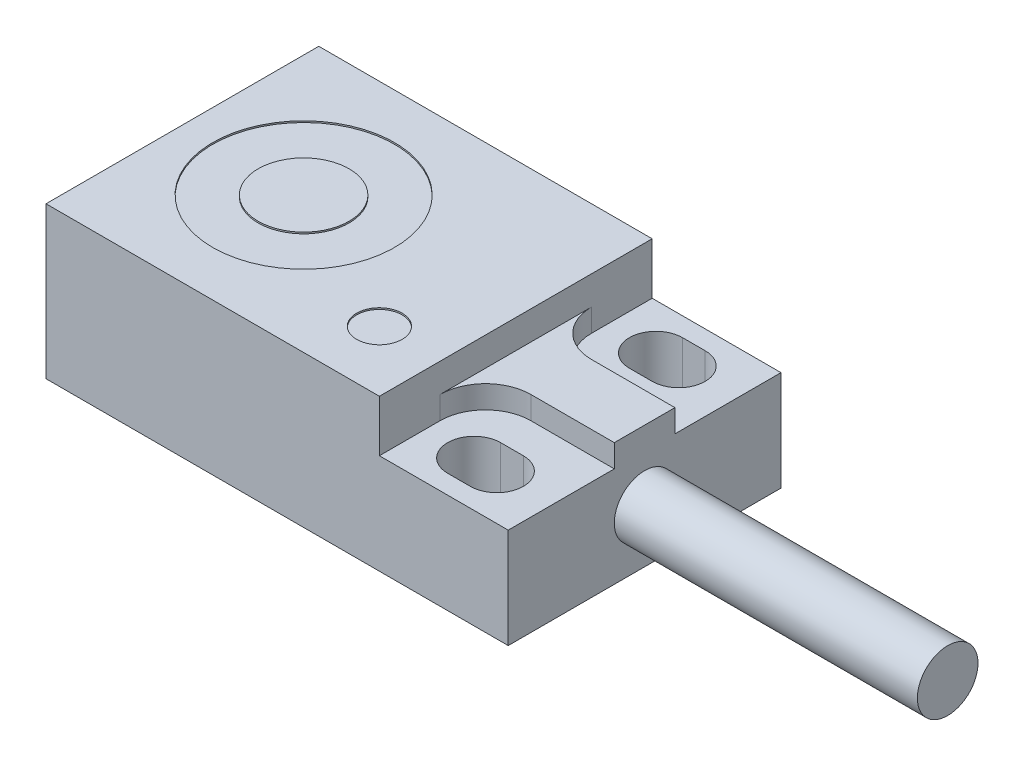
ISO-10303-21;
HEADER;
FILE_DESCRIPTION(('STEP AP214'),'2;1');
FILE_NAME('part.step','',(''),(''),'','','');
FILE_SCHEMA(('AUTOMOTIVE_DESIGN { 1 0 10303 214 1 1 1 1 }'));
ENDSEC;
DATA;
#1=APPLICATION_CONTEXT('core data for automotive mechanical design processes');
#2=APPLICATION_PROTOCOL_DEFINITION('international standard','automotive_design',2000,#1);
#3=PRODUCT_CONTEXT('',#1,'mechanical');
#4=PRODUCT('Part','Part','',(#3));
#5=PRODUCT_RELATED_PRODUCT_CATEGORY('part','',(#4));
#6=PRODUCT_DEFINITION_FORMATION('','',#4);
#7=PRODUCT_DEFINITION_CONTEXT('part definition',#1,'design');
#8=PRODUCT_DEFINITION('design','',#6,#7);
#9=PRODUCT_DEFINITION_SHAPE('','',#8);
#10=(LENGTH_UNIT() NAMED_UNIT(*) SI_UNIT(.MILLI.,.METRE.));
#11=(NAMED_UNIT(*) PLANE_ANGLE_UNIT() SI_UNIT($,.RADIAN.));
#12=(NAMED_UNIT(*) SI_UNIT($,.STERADIAN.) SOLID_ANGLE_UNIT());
#13=UNCERTAINTY_MEASURE_WITH_UNIT(LENGTH_MEASURE(1.E-05),#10,'distance_accuracy_value','');
#14=(GEOMETRIC_REPRESENTATION_CONTEXT(3) GLOBAL_UNCERTAINTY_ASSIGNED_CONTEXT((#13)) GLOBAL_UNIT_ASSIGNED_CONTEXT((#10,
#11,#12)) REPRESENTATION_CONTEXT('',''));
#15=CARTESIAN_POINT('',(0.,0.,0.));
#16=DIRECTION('',(0.,0.,1.));
#17=DIRECTION('',(1.,0.,0.));
#18=AXIS2_PLACEMENT_3D('',#15,#16,#17);
#19=CARTESIAN_POINT('',(-15.25,10.,-9.));
#20=DIRECTION('',(1.,0.,0.));
#21=DIRECTION('',(0.,0.,-1.));
#22=AXIS2_PLACEMENT_3D('',#19,#20,#21);
#23=PLANE('',#22);
#24=DIRECTION('',(0.,0.,1.));
#25=VECTOR('',#24,1.);
#26=CARTESIAN_POINT('',(-15.25,0.,-9.));
#27=LINE('',#26,#25);
#28=CARTESIAN_POINT('',(-15.25,0.,-9.));
#29=VERTEX_POINT('',#28);
#30=CARTESIAN_POINT('',(-15.25,0.,9.));
#31=VERTEX_POINT('',#30);
#32=EDGE_CURVE('E215',#29,#31,#27,.T.);
#33=ORIENTED_EDGE('',*,*,#32,.T.);
#34=DIRECTION('',(0.,-1.,0.));
#35=VECTOR('',#34,1.);
#36=CARTESIAN_POINT('',(-15.25,10.,9.));
#37=LINE('',#36,#35);
#38=CARTESIAN_POINT('',(-15.25,10.,9.));
#39=VERTEX_POINT('',#38);
#40=EDGE_CURVE('E232',#39,#31,#37,.T.);
#41=ORIENTED_EDGE('',*,*,#40,.F.);
#42=DIRECTION('',(0.,0.,1.));
#43=VECTOR('',#42,1.);
#44=CARTESIAN_POINT('',(-15.25,10.,-9.));
#45=LINE('',#44,#43);
#46=CARTESIAN_POINT('',(-15.25,10.,-9.));
#47=VERTEX_POINT('',#46);
#48=EDGE_CURVE('E205',#47,#39,#45,.T.);
#49=ORIENTED_EDGE('',*,*,#48,.F.);
#50=DIRECTION('',(0.,-1.,0.));
#51=VECTOR('',#50,1.);
#52=CARTESIAN_POINT('',(-15.25,10.,-9.));
#53=LINE('',#52,#51);
#54=EDGE_CURVE('E214',#47,#29,#53,.T.);
#55=ORIENTED_EDGE('',*,*,#54,.T.);
#56=EDGE_LOOP('',(#33,#41,#49,#55));
#57=FACE_BOUND('',#56,.T.);
#58=ADVANCED_FACE('F34',(#57),#23,.F.);
#59=CARTESIAN_POINT('',(-15.25,10.,9.));
#60=DIRECTION('',(0.,0.,-1.));
#61=DIRECTION('',(-1.,0.,0.));
#62=AXIS2_PLACEMENT_3D('',#59,#60,#61);
#63=PLANE('',#62);
#64=DIRECTION('',(1.,0.,0.));
#65=VECTOR('',#64,1.);
#66=CARTESIAN_POINT('',(6.75,6.6,9.));
#67=LINE('',#66,#65);
#68=CARTESIAN_POINT('',(6.75,6.6,9.));
#69=VERTEX_POINT('',#68);
#70=CARTESIAN_POINT('',(15.25,6.6,9.));
#71=VERTEX_POINT('',#70);
#72=EDGE_CURVE('E198',#69,#71,#67,.T.);
#73=ORIENTED_EDGE('',*,*,#72,.F.);
#74=DIRECTION('',(0.,1.,0.));
#75=VECTOR('',#74,1.);
#76=CARTESIAN_POINT('',(6.75,6.6,9.));
#77=LINE('',#76,#75);
#78=CARTESIAN_POINT('',(6.75,10.,9.));
#79=VERTEX_POINT('',#78);
#80=EDGE_CURVE('E219',#69,#79,#77,.T.);
#81=ORIENTED_EDGE('',*,*,#80,.T.);
#82=DIRECTION('',(1.,0.,0.));
#83=VECTOR('',#82,1.);
#84=CARTESIAN_POINT('',(-15.25,10.,9.));
#85=LINE('',#84,#83);
#86=EDGE_CURVE('E208',#39,#79,#85,.T.);
#87=ORIENTED_EDGE('',*,*,#86,.F.);
#88=ORIENTED_EDGE('',*,*,#40,.T.);
#89=DIRECTION('',(1.,0.,0.));
#90=VECTOR('',#89,1.);
#91=CARTESIAN_POINT('',(-15.25,0.,9.));
#92=LINE('',#91,#90);
#93=CARTESIAN_POINT('',(15.25,0.,9.));
#94=VERTEX_POINT('',#93);
#95=EDGE_CURVE('E218',#31,#94,#92,.T.);
#96=ORIENTED_EDGE('',*,*,#95,.T.);
#97=DIRECTION('',(0.,-1.,0.));
#98=VECTOR('',#97,1.);
#99=CARTESIAN_POINT('',(15.25,10.,9.));
#100=LINE('',#99,#98);
#101=EDGE_CURVE('E230',#71,#94,#100,.T.);
#102=ORIENTED_EDGE('',*,*,#101,.F.);
#103=EDGE_LOOP('',(#73,#81,#87,#88,#96,#102));
#104=FACE_BOUND('',#103,.T.);
#105=ADVANCED_FACE('F375',(#104),#63,.F.);
#106=CARTESIAN_POINT('',(15.25,10.,-9.));
#107=DIRECTION('',(-1.,0.,0.));
#108=DIRECTION('',(0.,0.,1.));
#109=AXIS2_PLACEMENT_3D('',#106,#107,#108);
#110=PLANE('',#109);
#111=CARTESIAN_POINT('',(15.25,3.5,0.));
#112=DIRECTION('',(-1.,0.,0.));
#113=DIRECTION('',(0.,0.,1.));
#114=AXIS2_PLACEMENT_3D('',#111,#112,#113);
#115=CIRCLE('',#114,2.);
#116=CARTESIAN_POINT('',(15.25,3.5,2.));
#117=VERTEX_POINT('',#116);
#118=EDGE_CURVE('E11',#117,#117,#115,.F.);
#119=ORIENTED_EDGE('',*,*,#118,.F.);
#120=EDGE_LOOP('',(#119));
#121=FACE_BOUND('',#120,.T.);
#122=DIRECTION('',(0.,1.,0.));
#123=VECTOR('',#122,1.);
#124=CARTESIAN_POINT('',(15.25,6.6,-2.));
#125=LINE('',#124,#123);
#126=CARTESIAN_POINT('',(15.25,6.6,-2.));
#127=VERTEX_POINT('',#126);
#128=CARTESIAN_POINT('',(15.25,8.1,-2.));
#129=VERTEX_POINT('',#128);
#130=EDGE_CURVE('E186',#127,#129,#125,.T.);
#131=ORIENTED_EDGE('',*,*,#130,.T.);
#132=DIRECTION('',(0.,0.,-1.));
#133=VECTOR('',#132,1.);
#134=CARTESIAN_POINT('',(15.25,8.1,-2.));
#135=LINE('',#134,#133);
#136=CARTESIAN_POINT('',(15.25,8.1,2.));
#137=VERTEX_POINT('',#136);
#138=EDGE_CURVE('E169',#137,#129,#135,.T.);
#139=ORIENTED_EDGE('',*,*,#138,.F.);
#140=DIRECTION('',(0.,1.,0.));
#141=VECTOR('',#140,1.);
#142=CARTESIAN_POINT('',(15.25,6.6,2.));
#143=LINE('',#142,#141);
#144=CARTESIAN_POINT('',(15.25,6.6,2.));
#145=VERTEX_POINT('',#144);
#146=EDGE_CURVE('E266',#145,#137,#143,.T.);
#147=ORIENTED_EDGE('',*,*,#146,.F.);
#148=DIRECTION('',(0.,0.,-1.));
#149=VECTOR('',#148,1.);
#150=CARTESIAN_POINT('',(15.25,6.6,9.));
#151=LINE('',#150,#149);
#152=EDGE_CURVE('E274',#71,#145,#151,.T.);
#153=ORIENTED_EDGE('',*,*,#152,.F.);
#154=ORIENTED_EDGE('',*,*,#101,.T.);
#155=DIRECTION('',(0.,0.,-1.));
#156=VECTOR('',#155,1.);
#157=CARTESIAN_POINT('',(15.25,0.,-9.));
#158=LINE('',#157,#156);
#159=CARTESIAN_POINT('',(15.25,0.,-9.));
#160=VERTEX_POINT('',#159);
#161=EDGE_CURVE('E222',#94,#160,#158,.T.);
#162=ORIENTED_EDGE('',*,*,#161,.T.);
#163=DIRECTION('',(0.,-1.,0.));
#164=VECTOR('',#163,1.);
#165=CARTESIAN_POINT('',(15.25,10.,-9.));
#166=LINE('',#165,#164);
#167=CARTESIAN_POINT('',(15.25,6.6,-9.));
#168=VERTEX_POINT('',#167);
#169=EDGE_CURVE('E228',#168,#160,#166,.T.);
#170=ORIENTED_EDGE('',*,*,#169,.F.);
#171=DIRECTION('',(0.,0.,-1.));
#172=VECTOR('',#171,1.);
#173=CARTESIAN_POINT('',(15.25,6.6,-9.));
#174=LINE('',#173,#172);
#175=EDGE_CURVE('E194',#127,#168,#174,.T.);
#176=ORIENTED_EDGE('',*,*,#175,.F.);
#177=EDGE_LOOP('',(#131,#139,#147,#153,#154,#162,#170,#176));
#178=FACE_BOUND('',#177,.T.);
#179=ADVANCED_FACE('F192',(#121,#178),#110,.F.);
#180=CARTESIAN_POINT('',(-15.25,10.,-9.));
#181=DIRECTION('',(0.,0.,1.));
#182=DIRECTION('',(1.,0.,0.));
#183=AXIS2_PLACEMENT_3D('',#180,#181,#182);
#184=PLANE('',#183);
#185=DIRECTION('',(-1.,0.,0.));
#186=VECTOR('',#185,1.);
#187=CARTESIAN_POINT('',(-15.25,10.,-9.));
#188=LINE('',#187,#186);
#189=CARTESIAN_POINT('',(6.74999999999999,10.,-9.));
#190=VERTEX_POINT('',#189);
#191=EDGE_CURVE('E212',#190,#47,#188,.T.);
#192=ORIENTED_EDGE('',*,*,#191,.F.);
#193=DIRECTION('',(0.,1.,0.));
#194=VECTOR('',#193,1.);
#195=CARTESIAN_POINT('',(6.75,6.6,-9.));
#196=LINE('',#195,#194);
#197=CARTESIAN_POINT('',(6.75,6.6,-9.));
#198=VERTEX_POINT('',#197);
#199=EDGE_CURVE('E196',#198,#190,#196,.T.);
#200=ORIENTED_EDGE('',*,*,#199,.F.);
#201=DIRECTION('',(-1.,0.,0.));
#202=VECTOR('',#201,1.);
#203=CARTESIAN_POINT('',(6.75,6.6,-9.));
#204=LINE('',#203,#202);
#205=EDGE_CURVE('E259',#168,#198,#204,.T.);
#206=ORIENTED_EDGE('',*,*,#205,.F.);
#207=ORIENTED_EDGE('',*,*,#169,.T.);
#208=DIRECTION('',(-1.,0.,0.));
#209=VECTOR('',#208,1.);
#210=CARTESIAN_POINT('',(-15.25,0.,-9.));
#211=LINE('',#210,#209);
#212=EDGE_CURVE('E209',#160,#29,#211,.T.);
#213=ORIENTED_EDGE('',*,*,#212,.T.);
#214=ORIENTED_EDGE('',*,*,#54,.F.);
#215=EDGE_LOOP('',(#192,#200,#206,#207,#213,#214));
#216=FACE_BOUND('',#215,.T.);
#217=ADVANCED_FACE('F374',(#216),#184,.F.);
#218=CARTESIAN_POINT('',(0.,10.,0.));
#219=DIRECTION('',(0.,1.,0.));
#220=DIRECTION('',(0.,0.,1.));
#221=AXIS2_PLACEMENT_3D('',#218,#219,#220);
#222=PLANE('',#221);
#223=CARTESIAN_POINT('',(-7.25,10.,0.));
#224=DIRECTION('',(0.,1.,0.));
#225=DIRECTION('',(0.,0.,1.));
#226=AXIS2_PLACEMENT_3D('',#223,#224,#225);
#227=CIRCLE('',#226,6.);
#228=CARTESIAN_POINT('',(-7.25,10.,6.));
#229=VERTEX_POINT('',#228);
#230=EDGE_CURVE('E351',#229,#229,#227,.T.);
#231=ORIENTED_EDGE('',*,*,#230,.F.);
#232=EDGE_LOOP('',(#231));
#233=FACE_BOUND('',#232,.T.);
#234=CARTESIAN_POINT('',(2.74999999999999,10.,5.));
#235=DIRECTION('',(0.,1.,0.));
#236=DIRECTION('',(0.,0.,1.));
#237=AXIS2_PLACEMENT_3D('',#234,#235,#236);
#238=CIRCLE('',#237,1.5);
#239=CARTESIAN_POINT('',(2.74999999999999,10.,6.5));
#240=VERTEX_POINT('',#239);
#241=EDGE_CURVE('E343',#240,#240,#238,.T.);
#242=ORIENTED_EDGE('',*,*,#241,.F.);
#243=EDGE_LOOP('',(#242));
#244=FACE_BOUND('',#243,.T.);
#245=DIRECTION('',(0.,0.,1.));
#246=VECTOR('',#245,1.);
#247=CARTESIAN_POINT('',(6.75,10.,9.));
#248=LINE('',#247,#246);
#249=EDGE_CURVE('E195',#190,#79,#248,.T.);
#250=ORIENTED_EDGE('',*,*,#249,.F.);
#251=ORIENTED_EDGE('',*,*,#191,.T.);
#252=ORIENTED_EDGE('',*,*,#48,.T.);
#253=ORIENTED_EDGE('',*,*,#86,.T.);
#254=EDGE_LOOP('',(#250,#251,#252,#253));
#255=FACE_BOUND('',#254,.T.);
#256=ADVANCED_FACE('F381',(#233,#244,#255),#222,.T.);
#257=CARTESIAN_POINT('',(0.,0.,0.));
#258=DIRECTION('',(0.,1.,0.));
#259=DIRECTION('',(0.,0.,1.));
#260=AXIS2_PLACEMENT_3D('',#257,#258,#259);
#261=PLANE('',#260);
#262=DIRECTION('',(-1.,0.,0.));
#263=VECTOR('',#262,1.);
#264=CARTESIAN_POINT('',(10.,0.,-7.75));
#265=LINE('',#264,#263);
#266=CARTESIAN_POINT('',(11.5,0.,-7.75));
#267=VERTEX_POINT('',#266);
#268=CARTESIAN_POINT('',(10.,0.,-7.75));
#269=VERTEX_POINT('',#268);
#270=EDGE_CURVE('E315',#267,#269,#265,.T.);
#271=ORIENTED_EDGE('',*,*,#270,.T.);
#272=CARTESIAN_POINT('',(10.,0.,-6.));
#273=DIRECTION('',(0.,1.,0.));
#274=DIRECTION('',(0.,0.,1.));
#275=AXIS2_PLACEMENT_3D('',#272,#273,#274);
#276=CIRCLE('',#275,1.75);
#277=CARTESIAN_POINT('',(10.,0.,-4.25));
#278=VERTEX_POINT('',#277);
#279=EDGE_CURVE('E323',#269,#278,#276,.T.);
#280=ORIENTED_EDGE('',*,*,#279,.T.);
#281=DIRECTION('',(1.,0.,0.));
#282=VECTOR('',#281,1.);
#283=CARTESIAN_POINT('',(10.,0.,-4.25));
#284=LINE('',#283,#282);
#285=CARTESIAN_POINT('',(11.5,0.,-4.25));
#286=VERTEX_POINT('',#285);
#287=EDGE_CURVE('E336',#278,#286,#284,.T.);
#288=ORIENTED_EDGE('',*,*,#287,.T.);
#289=CARTESIAN_POINT('',(11.5,0.,-6.));
#290=DIRECTION('',(0.,1.,0.));
#291=DIRECTION('',(0.,0.,1.));
#292=AXIS2_PLACEMENT_3D('',#289,#290,#291);
#293=CIRCLE('',#292,1.75);
#294=EDGE_CURVE('E333',#286,#267,#293,.T.);
#295=ORIENTED_EDGE('',*,*,#294,.T.);
#296=EDGE_LOOP('',(#271,#280,#288,#295));
#297=FACE_BOUND('',#296,.T.);
#298=DIRECTION('',(-1.,0.,0.));
#299=VECTOR('',#298,1.);
#300=CARTESIAN_POINT('',(10.,0.,4.25));
#301=LINE('',#300,#299);
#302=CARTESIAN_POINT('',(11.5,0.,4.25));
#303=VERTEX_POINT('',#302);
#304=CARTESIAN_POINT('',(10.,0.,4.25));
#305=VERTEX_POINT('',#304);
#306=EDGE_CURVE('E282',#303,#305,#301,.T.);
#307=ORIENTED_EDGE('',*,*,#306,.T.);
#308=CARTESIAN_POINT('',(10.,0.,6.));
#309=DIRECTION('',(0.,1.,0.));
#310=DIRECTION('',(0.,0.,-1.));
#311=AXIS2_PLACEMENT_3D('',#308,#309,#310);
#312=CIRCLE('',#311,1.75);
#313=CARTESIAN_POINT('',(10.,0.,7.75));
#314=VERTEX_POINT('',#313);
#315=EDGE_CURVE('E292',#305,#314,#312,.T.);
#316=ORIENTED_EDGE('',*,*,#315,.T.);
#317=DIRECTION('',(1.,0.,0.));
#318=VECTOR('',#317,1.);
#319=CARTESIAN_POINT('',(10.,0.,7.75));
#320=LINE('',#319,#318);
#321=CARTESIAN_POINT('',(11.5,0.,7.75));
#322=VERTEX_POINT('',#321);
#323=EDGE_CURVE('E306',#314,#322,#320,.T.);
#324=ORIENTED_EDGE('',*,*,#323,.T.);
#325=CARTESIAN_POINT('',(11.5,0.,6.));
#326=DIRECTION('',(0.,1.,0.));
#327=DIRECTION('',(0.,0.,-1.));
#328=AXIS2_PLACEMENT_3D('',#325,#326,#327);
#329=CIRCLE('',#328,1.75);
#330=EDGE_CURVE('E303',#322,#303,#329,.T.);
#331=ORIENTED_EDGE('',*,*,#330,.T.);
#332=EDGE_LOOP('',(#307,#316,#324,#331));
#333=FACE_BOUND('',#332,.T.);
#334=ORIENTED_EDGE('',*,*,#32,.F.);
#335=ORIENTED_EDGE('',*,*,#212,.F.);
#336=ORIENTED_EDGE('',*,*,#161,.F.);
#337=ORIENTED_EDGE('',*,*,#95,.F.);
#338=EDGE_LOOP('',(#334,#335,#336,#337));
#339=FACE_BOUND('',#338,.T.);
#340=ADVANCED_FACE('F450',(#297,#333,#339),#261,.F.);
#341=CARTESIAN_POINT('',(6.75,6.6,-2.));
#342=DIRECTION('',(0.,0.,1.));
#343=DIRECTION('',(1.,0.,0.));
#344=AXIS2_PLACEMENT_3D('',#341,#342,#343);
#345=PLANE('',#344);
#346=DIRECTION('',(1.,0.,0.));
#347=VECTOR('',#346,1.);
#348=CARTESIAN_POINT('',(6.75,6.6,-2.));
#349=LINE('',#348,#347);
#350=CARTESIAN_POINT('',(9.75,6.6,-2.));
#351=VERTEX_POINT('',#350);
#352=EDGE_CURVE('E261',#351,#127,#349,.T.);
#353=ORIENTED_EDGE('',*,*,#352,.F.);
#354=DIRECTION('',(0.,1.,0.));
#355=VECTOR('',#354,1.);
#356=CARTESIAN_POINT('',(9.75,8.1,-2.));
#357=LINE('',#356,#355);
#358=CARTESIAN_POINT('',(9.75,8.1,-2.));
#359=VERTEX_POINT('',#358);
#360=EDGE_CURVE('E189',#351,#359,#357,.T.);
#361=ORIENTED_EDGE('',*,*,#360,.T.);
#362=DIRECTION('',(-1.,0.,0.));
#363=VECTOR('',#362,1.);
#364=CARTESIAN_POINT('',(15.25,8.1,-2.));
#365=LINE('',#364,#363);
#366=EDGE_CURVE('E173',#129,#359,#365,.T.);
#367=ORIENTED_EDGE('',*,*,#366,.F.);
#368=ORIENTED_EDGE('',*,*,#130,.F.);
#369=EDGE_LOOP('',(#353,#361,#367,#368));
#370=FACE_BOUND('',#369,.T.);
#371=ADVANCED_FACE('F185',(#370),#345,.F.);
#372=CARTESIAN_POINT('',(0.,6.6,0.));
#373=DIRECTION('',(0.,-1.,0.));
#374=DIRECTION('',(0.,0.,-1.));
#375=AXIS2_PLACEMENT_3D('',#372,#373,#374);
#376=PLANE('',#375);
#377=DIRECTION('',(1.,0.,0.));
#378=VECTOR('',#377,1.);
#379=CARTESIAN_POINT('',(10.,6.6,-4.25));
#380=LINE('',#379,#378);
#381=CARTESIAN_POINT('',(10.,6.6,-4.25));
#382=VERTEX_POINT('',#381);
#383=CARTESIAN_POINT('',(11.5,6.6,-4.25));
#384=VERTEX_POINT('',#383);
#385=EDGE_CURVE('E327',#382,#384,#380,.T.);
#386=ORIENTED_EDGE('',*,*,#385,.F.);
#387=CARTESIAN_POINT('',(10.,6.6,-6.));
#388=DIRECTION('',(0.,1.,0.));
#389=DIRECTION('',(0.,0.,1.));
#390=AXIS2_PLACEMENT_3D('',#387,#388,#389);
#391=CIRCLE('',#390,1.75);
#392=CARTESIAN_POINT('',(10.,6.6,-7.75));
#393=VERTEX_POINT('',#392);
#394=EDGE_CURVE('E288',#393,#382,#391,.T.);
#395=ORIENTED_EDGE('',*,*,#394,.F.);
#396=DIRECTION('',(-1.,0.,0.));
#397=VECTOR('',#396,1.);
#398=CARTESIAN_POINT('',(10.,6.6,-7.75));
#399=LINE('',#398,#397);
#400=CARTESIAN_POINT('',(11.5,6.6,-7.75));
#401=VERTEX_POINT('',#400);
#402=EDGE_CURVE('E320',#401,#393,#399,.T.);
#403=ORIENTED_EDGE('',*,*,#402,.F.);
#404=CARTESIAN_POINT('',(11.5,6.6,-6.));
#405=DIRECTION('',(0.,1.,0.));
#406=DIRECTION('',(0.,0.,1.));
#407=AXIS2_PLACEMENT_3D('',#404,#405,#406);
#408=CIRCLE('',#407,1.75);
#409=EDGE_CURVE('E324',#384,#401,#408,.T.);
#410=ORIENTED_EDGE('',*,*,#409,.F.);
#411=EDGE_LOOP('',(#386,#395,#403,#410));
#412=FACE_BOUND('',#411,.T.);
#413=DIRECTION('',(0.,0.,1.));
#414=VECTOR('',#413,1.);
#415=CARTESIAN_POINT('',(6.75,6.6,-9.));
#416=LINE('',#415,#414);
#417=CARTESIAN_POINT('',(6.75,6.6,-5.));
#418=VERTEX_POINT('',#417);
#419=EDGE_CURVE('E254',#198,#418,#416,.T.);
#420=ORIENTED_EDGE('',*,*,#419,.T.);
#421=CARTESIAN_POINT('',(9.75,6.6,-5.));
#422=DIRECTION('',(0.,-1.,0.));
#423=DIRECTION('',(0.,0.,-1.));
#424=AXIS2_PLACEMENT_3D('',#421,#422,#423);
#425=CIRCLE('',#424,3.);
#426=EDGE_CURVE('E241',#418,#351,#425,.F.);
#427=ORIENTED_EDGE('',*,*,#426,.T.);
#428=ORIENTED_EDGE('',*,*,#352,.T.);
#429=ORIENTED_EDGE('',*,*,#175,.T.);
#430=ORIENTED_EDGE('',*,*,#205,.T.);
#431=EDGE_LOOP('',(#420,#427,#428,#429,#430));
#432=FACE_BOUND('',#431,.T.);
#433=ADVANCED_FACE('F257',(#412,#432),#376,.F.);
#434=CARTESIAN_POINT('',(6.75,6.6,9.));
#435=DIRECTION('',(-1.,0.,0.));
#436=DIRECTION('',(0.,0.,1.));
#437=AXIS2_PLACEMENT_3D('',#434,#435,#436);
#438=PLANE('',#437);
#439=DIRECTION('',(0.,0.,1.));
#440=VECTOR('',#439,1.);
#441=CARTESIAN_POINT('',(6.75,8.1,-2.));
#442=LINE('',#441,#440);
#443=CARTESIAN_POINT('',(6.75,8.1,-5.));
#444=VERTEX_POINT('',#443);
#445=CARTESIAN_POINT('',(6.75,8.1,5.));
#446=VERTEX_POINT('',#445);
#447=EDGE_CURVE('E190',#444,#446,#442,.T.);
#448=ORIENTED_EDGE('',*,*,#447,.F.);
#449=DIRECTION('',(0.,1.,0.));
#450=VECTOR('',#449,1.);
#451=CARTESIAN_POINT('',(6.75,6.6,-5.));
#452=LINE('',#451,#450);
#453=EDGE_CURVE('E239',#444,#418,#452,.F.);
#454=ORIENTED_EDGE('',*,*,#453,.T.);
#455=ORIENTED_EDGE('',*,*,#419,.F.);
#456=ORIENTED_EDGE('',*,*,#199,.T.);
#457=ORIENTED_EDGE('',*,*,#249,.T.);
#458=ORIENTED_EDGE('',*,*,#80,.F.);
#459=DIRECTION('',(0.,0.,1.));
#460=VECTOR('',#459,1.);
#461=CARTESIAN_POINT('',(6.75,6.6,9.));
#462=LINE('',#461,#460);
#463=CARTESIAN_POINT('',(6.75,6.6,5.));
#464=VERTEX_POINT('',#463);
#465=EDGE_CURVE('E268',#464,#69,#462,.T.);
#466=ORIENTED_EDGE('',*,*,#465,.F.);
#467=DIRECTION('',(0.,1.,0.));
#468=VECTOR('',#467,1.);
#469=CARTESIAN_POINT('',(6.75,8.1,5.));
#470=LINE('',#469,#468);
#471=EDGE_CURVE('E236',#464,#446,#470,.T.);
#472=ORIENTED_EDGE('',*,*,#471,.T.);
#473=EDGE_LOOP('',(#448,#454,#455,#456,#457,#458,#466,#472));
#474=FACE_BOUND('',#473,.T.);
#475=ADVANCED_FACE('F253',(#474),#438,.F.);
#476=CARTESIAN_POINT('',(6.75,6.6,2.));
#477=DIRECTION('',(0.,0.,-1.));
#478=DIRECTION('',(-1.,0.,0.));
#479=AXIS2_PLACEMENT_3D('',#476,#477,#478);
#480=PLANE('',#479);
#481=DIRECTION('',(1.,0.,0.));
#482=VECTOR('',#481,1.);
#483=CARTESIAN_POINT('',(15.25,8.1,2.));
#484=LINE('',#483,#482);
#485=CARTESIAN_POINT('',(9.75,8.1,2.));
#486=VERTEX_POINT('',#485);
#487=EDGE_CURVE('E174',#486,#137,#484,.T.);
#488=ORIENTED_EDGE('',*,*,#487,.F.);
#489=DIRECTION('',(0.,1.,0.));
#490=VECTOR('',#489,1.);
#491=CARTESIAN_POINT('',(9.75,6.6,2.));
#492=LINE('',#491,#490);
#493=CARTESIAN_POINT('',(9.75,6.6,2.));
#494=VERTEX_POINT('',#493);
#495=EDGE_CURVE('E49',#486,#494,#492,.F.);
#496=ORIENTED_EDGE('',*,*,#495,.T.);
#497=DIRECTION('',(-1.,0.,0.));
#498=VECTOR('',#497,1.);
#499=CARTESIAN_POINT('',(6.75,6.6,2.));
#500=LINE('',#499,#498);
#501=EDGE_CURVE('E272',#145,#494,#500,.T.);
#502=ORIENTED_EDGE('',*,*,#501,.F.);
#503=ORIENTED_EDGE('',*,*,#146,.T.);
#504=EDGE_LOOP('',(#488,#496,#502,#503));
#505=FACE_BOUND('',#504,.T.);
#506=ADVANCED_FACE('F439',(#505),#480,.F.);
#507=CARTESIAN_POINT('',(0.,6.6,0.));
#508=DIRECTION('',(0.,1.,0.));
#509=DIRECTION('',(0.,0.,1.));
#510=AXIS2_PLACEMENT_3D('',#507,#508,#509);
#511=PLANE('',#510);
#512=CARTESIAN_POINT('',(10.,6.6,6.));
#513=DIRECTION('',(0.,1.,0.));
#514=DIRECTION('',(0.,0.,-1.));
#515=AXIS2_PLACEMENT_3D('',#512,#513,#514);
#516=CIRCLE('',#515,1.75);
#517=CARTESIAN_POINT('',(10.,6.6,4.25));
#518=VERTEX_POINT('',#517);
#519=CARTESIAN_POINT('',(10.,6.6,7.75));
#520=VERTEX_POINT('',#519);
#521=EDGE_CURVE('E299',#518,#520,#516,.T.);
#522=ORIENTED_EDGE('',*,*,#521,.F.);
#523=DIRECTION('',(-1.,0.,0.));
#524=VECTOR('',#523,1.);
#525=CARTESIAN_POINT('',(10.,6.6,4.25));
#526=LINE('',#525,#524);
#527=CARTESIAN_POINT('',(11.5,6.6,4.25));
#528=VERTEX_POINT('',#527);
#529=EDGE_CURVE('E289',#528,#518,#526,.T.);
#530=ORIENTED_EDGE('',*,*,#529,.F.);
#531=CARTESIAN_POINT('',(11.5,6.6,6.));
#532=DIRECTION('',(0.,1.,0.));
#533=DIRECTION('',(0.,0.,-1.));
#534=AXIS2_PLACEMENT_3D('',#531,#532,#533);
#535=CIRCLE('',#534,1.75);
#536=CARTESIAN_POINT('',(11.5,6.6,7.75));
#537=VERTEX_POINT('',#536);
#538=EDGE_CURVE('E293',#537,#528,#535,.T.);
#539=ORIENTED_EDGE('',*,*,#538,.F.);
#540=DIRECTION('',(1.,0.,0.));
#541=VECTOR('',#540,1.);
#542=CARTESIAN_POINT('',(10.,6.6,7.75));
#543=LINE('',#542,#541);
#544=EDGE_CURVE('E296',#520,#537,#543,.T.);
#545=ORIENTED_EDGE('',*,*,#544,.F.);
#546=EDGE_LOOP('',(#522,#530,#539,#545));
#547=FACE_BOUND('',#546,.T.);
#548=ORIENTED_EDGE('',*,*,#501,.T.);
#549=CARTESIAN_POINT('',(9.75,6.6,5.));
#550=DIRECTION('',(0.,1.,0.));
#551=DIRECTION('',(0.,0.,1.));
#552=AXIS2_PLACEMENT_3D('',#549,#550,#551);
#553=CIRCLE('',#552,3.);
#554=EDGE_CURVE('E244',#494,#464,#553,.T.);
#555=ORIENTED_EDGE('',*,*,#554,.T.);
#556=ORIENTED_EDGE('',*,*,#465,.T.);
#557=ORIENTED_EDGE('',*,*,#72,.T.);
#558=ORIENTED_EDGE('',*,*,#152,.T.);
#559=EDGE_LOOP('',(#548,#555,#556,#557,#558));
#560=FACE_BOUND('',#559,.T.);
#561=ADVANCED_FACE('F435',(#547,#560),#511,.T.);
#562=CARTESIAN_POINT('',(10.,0.,6.));
#563=DIRECTION('',(0.,1.,0.));
#564=DIRECTION('',(0.,0.,1.));
#565=AXIS2_PLACEMENT_3D('',#562,#563,#564);
#566=CYLINDRICAL_SURFACE('',#565,1.75);
#567=ORIENTED_EDGE('',*,*,#521,.T.);
#568=DIRECTION('',(0.,1.,0.));
#569=VECTOR('',#568,1.);
#570=CARTESIAN_POINT('',(10.,0.,7.75));
#571=LINE('',#570,#569);
#572=EDGE_CURVE('E278',#314,#520,#571,.T.);
#573=ORIENTED_EDGE('',*,*,#572,.F.);
#574=ORIENTED_EDGE('',*,*,#315,.F.);
#575=DIRECTION('',(0.,1.,0.));
#576=VECTOR('',#575,1.);
#577=CARTESIAN_POINT('',(10.,0.,4.25));
#578=LINE('',#577,#576);
#579=EDGE_CURVE('E286',#305,#518,#578,.T.);
#580=ORIENTED_EDGE('',*,*,#579,.T.);
#581=EDGE_LOOP('',(#567,#573,#574,#580));
#582=FACE_BOUND('',#581,.T.);
#583=ADVANCED_FACE('F425',(#582),#566,.F.);
#584=CARTESIAN_POINT('',(10.,0.,4.25));
#585=DIRECTION('',(0.,0.,-1.));
#586=DIRECTION('',(-1.,0.,0.));
#587=AXIS2_PLACEMENT_3D('',#584,#585,#586);
#588=PLANE('',#587);
#589=ORIENTED_EDGE('',*,*,#529,.T.);
#590=ORIENTED_EDGE('',*,*,#579,.F.);
#591=ORIENTED_EDGE('',*,*,#306,.F.);
#592=DIRECTION('',(0.,1.,0.));
#593=VECTOR('',#592,1.);
#594=CARTESIAN_POINT('',(11.5,0.,4.25));
#595=LINE('',#594,#593);
#596=EDGE_CURVE('E284',#303,#528,#595,.T.);
#597=ORIENTED_EDGE('',*,*,#596,.T.);
#598=EDGE_LOOP('',(#589,#590,#591,#597));
#599=FACE_BOUND('',#598,.T.);
#600=ADVANCED_FACE('F421',(#599),#588,.F.);
#601=CARTESIAN_POINT('',(11.5,0.,6.));
#602=DIRECTION('',(0.,1.,0.));
#603=DIRECTION('',(0.,0.,1.));
#604=AXIS2_PLACEMENT_3D('',#601,#602,#603);
#605=CYLINDRICAL_SURFACE('',#604,1.75);
#606=ORIENTED_EDGE('',*,*,#538,.T.);
#607=ORIENTED_EDGE('',*,*,#596,.F.);
#608=ORIENTED_EDGE('',*,*,#330,.F.);
#609=DIRECTION('',(0.,1.,0.));
#610=VECTOR('',#609,1.);
#611=CARTESIAN_POINT('',(11.5,0.,7.75));
#612=LINE('',#611,#610);
#613=EDGE_CURVE('E281',#322,#537,#612,.T.);
#614=ORIENTED_EDGE('',*,*,#613,.T.);
#615=EDGE_LOOP('',(#606,#607,#608,#614));
#616=FACE_BOUND('',#615,.T.);
#617=ADVANCED_FACE('F424',(#616),#605,.F.);
#618=CARTESIAN_POINT('',(10.,0.,7.75));
#619=DIRECTION('',(0.,0.,1.));
#620=DIRECTION('',(1.,0.,0.));
#621=AXIS2_PLACEMENT_3D('',#618,#619,#620);
#622=PLANE('',#621);
#623=ORIENTED_EDGE('',*,*,#544,.T.);
#624=ORIENTED_EDGE('',*,*,#613,.F.);
#625=ORIENTED_EDGE('',*,*,#323,.F.);
#626=ORIENTED_EDGE('',*,*,#572,.T.);
#627=EDGE_LOOP('',(#623,#624,#625,#626));
#628=FACE_BOUND('',#627,.T.);
#629=ADVANCED_FACE('F419',(#628),#622,.F.);
#630=CARTESIAN_POINT('',(10.,0.,-6.));
#631=DIRECTION('',(0.,1.,0.));
#632=DIRECTION('',(0.,0.,1.));
#633=AXIS2_PLACEMENT_3D('',#630,#631,#632);
#634=CYLINDRICAL_SURFACE('',#633,1.75);
#635=ORIENTED_EDGE('',*,*,#394,.T.);
#636=DIRECTION('',(0.,1.,0.));
#637=VECTOR('',#636,1.);
#638=CARTESIAN_POINT('',(10.,0.,-4.25));
#639=LINE('',#638,#637);
#640=EDGE_CURVE('E311',#278,#382,#639,.T.);
#641=ORIENTED_EDGE('',*,*,#640,.F.);
#642=ORIENTED_EDGE('',*,*,#279,.F.);
#643=DIRECTION('',(0.,1.,0.));
#644=VECTOR('',#643,1.);
#645=CARTESIAN_POINT('',(10.,0.,-7.75));
#646=LINE('',#645,#644);
#647=EDGE_CURVE('E263',#269,#393,#646,.T.);
#648=ORIENTED_EDGE('',*,*,#647,.T.);
#649=EDGE_LOOP('',(#635,#641,#642,#648));
#650=FACE_BOUND('',#649,.T.);
#651=ADVANCED_FACE('F412',(#650),#634,.F.);
#652=CARTESIAN_POINT('',(10.,0.,-7.75));
#653=DIRECTION('',(0.,0.,-1.));
#654=DIRECTION('',(-1.,0.,0.));
#655=AXIS2_PLACEMENT_3D('',#652,#653,#654);
#656=PLANE('',#655);
#657=ORIENTED_EDGE('',*,*,#402,.T.);
#658=ORIENTED_EDGE('',*,*,#647,.F.);
#659=ORIENTED_EDGE('',*,*,#270,.F.);
#660=DIRECTION('',(0.,1.,0.));
#661=VECTOR('',#660,1.);
#662=CARTESIAN_POINT('',(11.5,0.,-7.75));
#663=LINE('',#662,#661);
#664=EDGE_CURVE('E317',#267,#401,#663,.T.);
#665=ORIENTED_EDGE('',*,*,#664,.T.);
#666=EDGE_LOOP('',(#657,#658,#659,#665));
#667=FACE_BOUND('',#666,.T.);
#668=ADVANCED_FACE('F409',(#667),#656,.F.);
#669=CARTESIAN_POINT('',(11.5,0.,-6.));
#670=DIRECTION('',(0.,1.,0.));
#671=DIRECTION('',(0.,0.,1.));
#672=AXIS2_PLACEMENT_3D('',#669,#670,#671);
#673=CYLINDRICAL_SURFACE('',#672,1.75);
#674=ORIENTED_EDGE('',*,*,#409,.T.);
#675=ORIENTED_EDGE('',*,*,#664,.F.);
#676=ORIENTED_EDGE('',*,*,#294,.F.);
#677=DIRECTION('',(0.,1.,0.));
#678=VECTOR('',#677,1.);
#679=CARTESIAN_POINT('',(11.5,0.,-4.25));
#680=LINE('',#679,#678);
#681=EDGE_CURVE('E314',#286,#384,#680,.T.);
#682=ORIENTED_EDGE('',*,*,#681,.T.);
#683=EDGE_LOOP('',(#674,#675,#676,#682));
#684=FACE_BOUND('',#683,.T.);
#685=ADVANCED_FACE('F403',(#684),#673,.F.);
#686=CARTESIAN_POINT('',(10.,0.,-4.25));
#687=DIRECTION('',(0.,0.,1.));
#688=DIRECTION('',(1.,0.,0.));
#689=AXIS2_PLACEMENT_3D('',#686,#687,#688);
#690=PLANE('',#689);
#691=ORIENTED_EDGE('',*,*,#385,.T.);
#692=ORIENTED_EDGE('',*,*,#681,.F.);
#693=ORIENTED_EDGE('',*,*,#287,.F.);
#694=ORIENTED_EDGE('',*,*,#640,.T.);
#695=EDGE_LOOP('',(#691,#692,#693,#694));
#696=FACE_BOUND('',#695,.T.);
#697=ADVANCED_FACE('F398',(#696),#690,.F.);
#698=CARTESIAN_POINT('',(0.,8.1,0.));
#699=DIRECTION('',(0.,-1.,0.));
#700=DIRECTION('',(0.,0.,-1.));
#701=AXIS2_PLACEMENT_3D('',#698,#699,#700);
#702=PLANE('',#701);
#703=ORIENTED_EDGE('',*,*,#138,.T.);
#704=ORIENTED_EDGE('',*,*,#366,.T.);
#705=CARTESIAN_POINT('',(9.75,8.1,-5.));
#706=DIRECTION('',(0.,-1.,0.));
#707=DIRECTION('',(0.,0.,-1.));
#708=AXIS2_PLACEMENT_3D('',#705,#706,#707);
#709=CIRCLE('',#708,3.);
#710=EDGE_CURVE('E246',#359,#444,#709,.T.);
#711=ORIENTED_EDGE('',*,*,#710,.T.);
#712=ORIENTED_EDGE('',*,*,#447,.T.);
#713=CARTESIAN_POINT('',(9.75,8.1,5.));
#714=DIRECTION('',(0.,-1.,0.));
#715=DIRECTION('',(0.,0.,-1.));
#716=AXIS2_PLACEMENT_3D('',#713,#714,#715);
#717=CIRCLE('',#716,3.);
#718=EDGE_CURVE('E42',#446,#486,#717,.T.);
#719=ORIENTED_EDGE('',*,*,#718,.T.);
#720=ORIENTED_EDGE('',*,*,#487,.T.);
#721=EDGE_LOOP('',(#703,#704,#711,#712,#719,#720));
#722=FACE_BOUND('',#721,.T.);
#723=ADVANCED_FACE('F171',(#722),#702,.F.);
#724=CARTESIAN_POINT('',(9.75,6.6,-5.));
#725=DIRECTION('',(0.,-1.,0.));
#726=DIRECTION('',(0.,0.,-1.));
#727=AXIS2_PLACEMENT_3D('',#724,#725,#726);
#728=CYLINDRICAL_SURFACE('',#727,3.);
#729=ORIENTED_EDGE('',*,*,#426,.F.);
#730=ORIENTED_EDGE('',*,*,#453,.F.);
#731=ORIENTED_EDGE('',*,*,#710,.F.);
#732=ORIENTED_EDGE('',*,*,#360,.F.);
#733=EDGE_LOOP('',(#729,#730,#731,#732));
#734=FACE_BOUND('',#733,.T.);
#735=ADVANCED_FACE('F250',(#734),#728,.F.);
#736=CARTESIAN_POINT('',(9.75,6.6,5.));
#737=DIRECTION('',(0.,-1.,0.));
#738=DIRECTION('',(0.,0.,-1.));
#739=AXIS2_PLACEMENT_3D('',#736,#737,#738);
#740=CYLINDRICAL_SURFACE('',#739,3.);
#741=ORIENTED_EDGE('',*,*,#554,.F.);
#742=ORIENTED_EDGE('',*,*,#495,.F.);
#743=ORIENTED_EDGE('',*,*,#718,.F.);
#744=ORIENTED_EDGE('',*,*,#471,.F.);
#745=EDGE_LOOP('',(#741,#742,#743,#744));
#746=FACE_BOUND('',#745,.T.);
#747=ADVANCED_FACE('F36',(#746),#740,.F.);
#748=CARTESIAN_POINT('',(2.74999999999999,9.9,5.));
#749=DIRECTION('',(0.,1.,0.));
#750=DIRECTION('',(0.,0.,1.));
#751=AXIS2_PLACEMENT_3D('',#748,#749,#750);
#752=CYLINDRICAL_SURFACE('',#751,1.5);
#753=CARTESIAN_POINT('',(2.74999999999999,9.9,5.));
#754=DIRECTION('',(0.,1.,0.));
#755=DIRECTION('',(0.,0.,1.));
#756=AXIS2_PLACEMENT_3D('',#753,#754,#755);
#757=CIRCLE('',#756,1.5);
#758=CARTESIAN_POINT('',(2.74999999999999,9.9,6.5));
#759=VERTEX_POINT('',#758);
#760=EDGE_CURVE('E346',#759,#759,#757,.T.);
#761=ORIENTED_EDGE('',*,*,#760,.F.);
#762=EDGE_LOOP('',(#761));
#763=FACE_BOUND('',#762,.T.);
#764=ORIENTED_EDGE('',*,*,#241,.T.);
#765=EDGE_LOOP('',(#764));
#766=FACE_BOUND('',#765,.T.);
#767=ADVANCED_FACE('F396',(#763,#766),#752,.F.);
#768=CARTESIAN_POINT('',(2.74999999999999,9.9,5.));
#769=DIRECTION('',(0.,1.,0.));
#770=DIRECTION('',(0.,0.,1.));
#771=AXIS2_PLACEMENT_3D('',#768,#769,#770);
#772=PLANE('',#771);
#773=ORIENTED_EDGE('',*,*,#760,.T.);
#774=EDGE_LOOP('',(#773));
#775=FACE_BOUND('',#774,.T.);
#776=ADVANCED_FACE('F590',(#775),#772,.T.);
#777=CARTESIAN_POINT('',(-7.25,9.9,0.));
#778=DIRECTION('',(0.,1.,0.));
#779=DIRECTION('',(0.,0.,1.));
#780=AXIS2_PLACEMENT_3D('',#777,#778,#779);
#781=CYLINDRICAL_SURFACE('',#780,6.);
#782=CARTESIAN_POINT('',(-7.25,9.9,0.));
#783=DIRECTION('',(0.,1.,0.));
#784=DIRECTION('',(0.,0.,1.));
#785=AXIS2_PLACEMENT_3D('',#782,#783,#784);
#786=CIRCLE('',#785,6.);
#787=CARTESIAN_POINT('',(-7.25,9.9,6.));
#788=VERTEX_POINT('',#787);
#789=EDGE_CURVE('E179',#788,#788,#786,.T.);
#790=ORIENTED_EDGE('',*,*,#789,.F.);
#791=EDGE_LOOP('',(#790));
#792=FACE_BOUND('',#791,.T.);
#793=ORIENTED_EDGE('',*,*,#230,.T.);
#794=EDGE_LOOP('',(#793));
#795=FACE_BOUND('',#794,.T.);
#796=ADVANCED_FACE('F598',(#792,#795),#781,.F.);
#797=CARTESIAN_POINT('',(-7.25,9.9,0.));
#798=DIRECTION('',(0.,1.,0.));
#799=DIRECTION('',(0.,0.,1.));
#800=AXIS2_PLACEMENT_3D('',#797,#798,#799);
#801=PLANE('',#800);
#802=CARTESIAN_POINT('',(-7.25,9.9,0.));
#803=DIRECTION('',(0.,1.,0.));
#804=DIRECTION('',(0.,0.,1.));
#805=AXIS2_PLACEMENT_3D('',#802,#803,#804);
#806=CIRCLE('',#805,3.);
#807=CARTESIAN_POINT('',(-7.25,9.9,3.));
#808=VERTEX_POINT('',#807);
#809=EDGE_CURVE('E354',#808,#808,#806,.T.);
#810=ORIENTED_EDGE('',*,*,#809,.F.);
#811=EDGE_LOOP('',(#810));
#812=FACE_BOUND('',#811,.T.);
#813=ORIENTED_EDGE('',*,*,#789,.T.);
#814=EDGE_LOOP('',(#813));
#815=FACE_BOUND('',#814,.T.);
#816=ADVANCED_FACE('F607',(#812,#815),#801,.T.);
#817=CARTESIAN_POINT('',(-7.25,9.9,0.));
#818=DIRECTION('',(0.,1.,0.));
#819=DIRECTION('',(0.,0.,1.));
#820=AXIS2_PLACEMENT_3D('',#817,#818,#819);
#821=CYLINDRICAL_SURFACE('',#820,3.);
#822=ORIENTED_EDGE('',*,*,#809,.T.);
#823=EDGE_LOOP('',(#822));
#824=FACE_BOUND('',#823,.T.);
#825=CARTESIAN_POINT('',(-7.25,10.,0.));
#826=DIRECTION('',(0.,1.,0.));
#827=DIRECTION('',(0.,0.,1.));
#828=AXIS2_PLACEMENT_3D('',#825,#826,#827);
#829=CIRCLE('',#828,3.);
#830=CARTESIAN_POINT('',(-7.25,10.,3.));
#831=VERTEX_POINT('',#830);
#832=EDGE_CURVE('E350',#831,#831,#829,.T.);
#833=ORIENTED_EDGE('',*,*,#832,.F.);
#834=EDGE_LOOP('',(#833));
#835=FACE_BOUND('',#834,.T.);
#836=ADVANCED_FACE('F580',(#824,#835),#821,.T.);
#837=ORIENTED_EDGE('',*,*,#832,.T.);
#838=EDGE_LOOP('',(#837));
#839=FACE_BOUND('',#838,.T.);
#840=ADVANCED_FACE('F369',(#839),#222,.T.);
#841=CARTESIAN_POINT('',(35.25,3.5,0.));
#842=DIRECTION('',(-1.,0.,0.));
#843=DIRECTION('',(0.,0.,1.));
#844=AXIS2_PLACEMENT_3D('',#841,#842,#843);
#845=CYLINDRICAL_SURFACE('',#844,2.);
#846=CARTESIAN_POINT('',(35.25,3.5,0.));
#847=DIRECTION('',(1.,0.,0.));
#848=DIRECTION('',(0.,0.,-1.));
#849=AXIS2_PLACEMENT_3D('',#846,#847,#848);
#850=CIRCLE('',#849,2.);
#851=CARTESIAN_POINT('',(35.25,3.5,-2.));
#852=VERTEX_POINT('',#851);
#853=EDGE_CURVE('E347',#852,#852,#850,.T.);
#854=ORIENTED_EDGE('',*,*,#853,.F.);
#855=EDGE_LOOP('',(#854));
#856=FACE_BOUND('',#855,.T.);
#857=ORIENTED_EDGE('',*,*,#118,.T.);
#858=EDGE_LOOP('',(#857));
#859=FACE_BOUND('',#858,.T.);
#860=ADVANCED_FACE('F366',(#856,#859),#845,.T.);
#861=CARTESIAN_POINT('',(35.25,3.5,0.));
#862=DIRECTION('',(1.,0.,0.));
#863=DIRECTION('',(0.,0.,-1.));
#864=AXIS2_PLACEMENT_3D('',#861,#862,#863);
#865=PLANE('',#864);
#866=ORIENTED_EDGE('',*,*,#853,.T.);
#867=EDGE_LOOP('',(#866));
#868=FACE_BOUND('',#867,.T.);
#869=ADVANCED_FACE('F364',(#868),#865,.T.);
#870=CLOSED_SHELL('',(#58,#105,#179,#217,#256,#340,#371,#433,#475,#506,#561,#583,#600,#617,#629,
#651,#668,#685,#697,#723,#735,#747,#767,#776,#796,#816,#836,#840,#860,#869));
#871=MANIFOLD_SOLID_BREP('B2',#870);
#872=ADVANCED_BREP_SHAPE_REPRESENTATION('',(#18,#871),#14);
#873=SHAPE_DEFINITION_REPRESENTATION(#9,#872);
ENDSEC;
END-ISO-10303-21;
